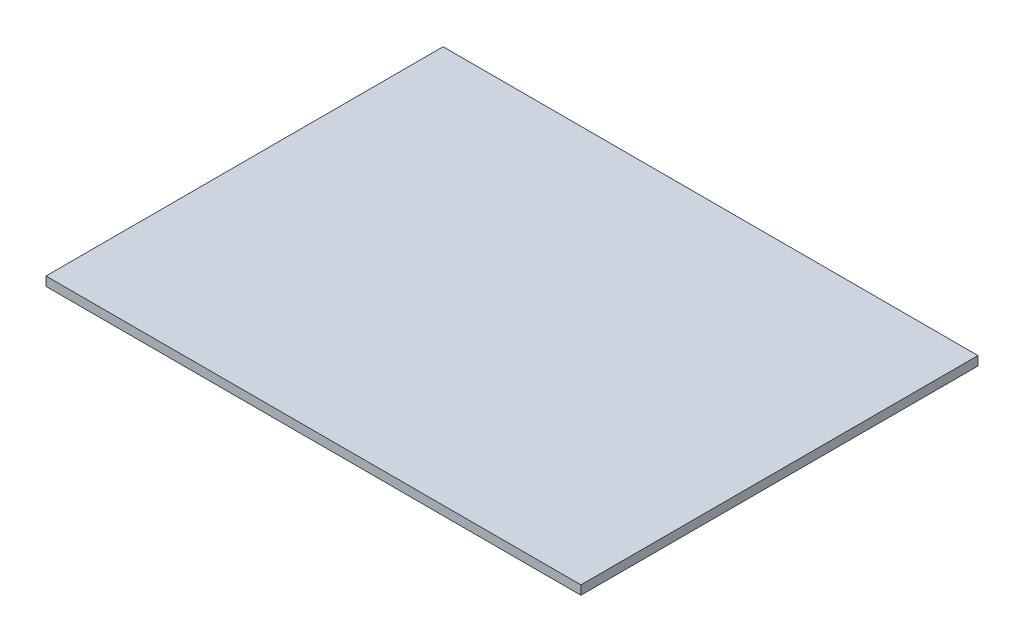
ISO-10303-21;
HEADER;
FILE_DESCRIPTION(('STEP AP214'),'2;1');
FILE_NAME('part.step','',(''),(''),'','','');
FILE_SCHEMA(('AUTOMOTIVE_DESIGN { 1 0 10303 214 1 1 1 1 }'));
ENDSEC;
DATA;
#1=APPLICATION_CONTEXT('core data for automotive mechanical design processes');
#2=APPLICATION_PROTOCOL_DEFINITION('international standard','automotive_design',2000,#1);
#3=PRODUCT_CONTEXT('',#1,'mechanical');
#4=PRODUCT('Part','Part','',(#3));
#5=PRODUCT_RELATED_PRODUCT_CATEGORY('part','',(#4));
#6=PRODUCT_DEFINITION_FORMATION('','',#4);
#7=PRODUCT_DEFINITION_CONTEXT('part definition',#1,'design');
#8=PRODUCT_DEFINITION('design','',#6,#7);
#9=PRODUCT_DEFINITION_SHAPE('','',#8);
#10=(LENGTH_UNIT() NAMED_UNIT(*) SI_UNIT(.MILLI.,.METRE.));
#11=(NAMED_UNIT(*) PLANE_ANGLE_UNIT() SI_UNIT($,.RADIAN.));
#12=(NAMED_UNIT(*) SI_UNIT($,.STERADIAN.) SOLID_ANGLE_UNIT());
#13=UNCERTAINTY_MEASURE_WITH_UNIT(LENGTH_MEASURE(1.E-05),#10,'distance_accuracy_value','');
#14=(GEOMETRIC_REPRESENTATION_CONTEXT(3) GLOBAL_UNCERTAINTY_ASSIGNED_CONTEXT((#13)) GLOBAL_UNIT_ASSIGNED_CONTEXT((#10,
#11,#12)) REPRESENTATION_CONTEXT('',''));
#15=CARTESIAN_POINT('',(0.,0.,0.));
#16=DIRECTION('',(0.,0.,1.));
#17=DIRECTION('',(1.,0.,0.));
#18=AXIS2_PLACEMENT_3D('',#15,#16,#17);
#19=CARTESIAN_POINT('',(-45.847,1.5494,34.036));
#20=DIRECTION('',(1.,0.,0.));
#21=DIRECTION('',(0.,0.,-1.));
#22=AXIS2_PLACEMENT_3D('',#19,#20,#21);
#23=PLANE('',#22);
#24=DIRECTION('',(0.,0.,1.));
#25=VECTOR('',#24,1.);
#26=CARTESIAN_POINT('',(-45.847,0.,34.036));
#27=LINE('',#26,#25);
#28=CARTESIAN_POINT('',(-45.847,0.,-34.036));
#29=VERTEX_POINT('',#28);
#30=CARTESIAN_POINT('',(-45.847,0.,34.036));
#31=VERTEX_POINT('',#30);
#32=EDGE_CURVE('E96',#29,#31,#27,.T.);
#33=ORIENTED_EDGE('',*,*,#32,.T.);
#34=DIRECTION('',(0.,-1.,0.));
#35=VECTOR('',#34,1.);
#36=CARTESIAN_POINT('',(-45.847,1.5494,34.036));
#37=LINE('',#36,#35);
#38=CARTESIAN_POINT('',(-45.847,1.5494,34.036));
#39=VERTEX_POINT('',#38);
#40=EDGE_CURVE('E11',#39,#31,#37,.T.);
#41=ORIENTED_EDGE('',*,*,#40,.F.);
#42=DIRECTION('',(0.,0.,1.));
#43=VECTOR('',#42,1.);
#44=CARTESIAN_POINT('',(-45.847,1.5494,34.036));
#45=LINE('',#44,#43);
#46=CARTESIAN_POINT('',(-45.847,1.5494,-34.036));
#47=VERTEX_POINT('',#46);
#48=EDGE_CURVE('E84',#47,#39,#45,.T.);
#49=ORIENTED_EDGE('',*,*,#48,.F.);
#50=DIRECTION('',(0.,-1.,0.));
#51=VECTOR('',#50,1.);
#52=CARTESIAN_POINT('',(-45.847,1.5494,-34.036));
#53=LINE('',#52,#51);
#54=EDGE_CURVE('E92',#47,#29,#53,.T.);
#55=ORIENTED_EDGE('',*,*,#54,.T.);
#56=EDGE_LOOP('',(#33,#41,#49,#55));
#57=FACE_BOUND('',#56,.T.);
#58=ADVANCED_FACE('F33',(#57),#23,.F.);
#59=CARTESIAN_POINT('',(45.847,1.5494,34.036));
#60=DIRECTION('',(0.,0.,-1.));
#61=DIRECTION('',(-1.,0.,0.));
#62=AXIS2_PLACEMENT_3D('',#59,#60,#61);
#63=PLANE('',#62);
#64=DIRECTION('',(1.,0.,0.));
#65=VECTOR('',#64,1.);
#66=CARTESIAN_POINT('',(45.847,0.,34.036));
#67=LINE('',#66,#65);
#68=CARTESIAN_POINT('',(45.847,0.,34.036));
#69=VERTEX_POINT('',#68);
#70=EDGE_CURVE('E88',#31,#69,#67,.T.);
#71=ORIENTED_EDGE('',*,*,#70,.T.);
#72=DIRECTION('',(0.,-1.,0.));
#73=VECTOR('',#72,1.);
#74=CARTESIAN_POINT('',(45.847,1.5494,34.036));
#75=LINE('',#74,#73);
#76=CARTESIAN_POINT('',(45.847,1.5494,34.036));
#77=VERTEX_POINT('',#76);
#78=EDGE_CURVE('E41',#77,#69,#75,.T.);
#79=ORIENTED_EDGE('',*,*,#78,.F.);
#80=DIRECTION('',(1.,0.,0.));
#81=VECTOR('',#80,1.);
#82=CARTESIAN_POINT('',(45.847,1.5494,34.036));
#83=LINE('',#82,#81);
#84=EDGE_CURVE('E79',#39,#77,#83,.T.);
#85=ORIENTED_EDGE('',*,*,#84,.F.);
#86=ORIENTED_EDGE('',*,*,#40,.T.);
#87=EDGE_LOOP('',(#71,#79,#85,#86));
#88=FACE_BOUND('',#87,.T.);
#89=ADVANCED_FACE('F87',(#88),#63,.F.);
#90=CARTESIAN_POINT('',(45.847,1.5494,34.036));
#91=DIRECTION('',(-1.,0.,0.));
#92=DIRECTION('',(0.,0.,1.));
#93=AXIS2_PLACEMENT_3D('',#90,#91,#92);
#94=PLANE('',#93);
#95=DIRECTION('',(0.,0.,-1.));
#96=VECTOR('',#95,1.);
#97=CARTESIAN_POINT('',(45.847,0.,34.036));
#98=LINE('',#97,#96);
#99=CARTESIAN_POINT('',(45.847,0.,-34.036));
#100=VERTEX_POINT('',#99);
#101=EDGE_CURVE('E66',#69,#100,#98,.T.);
#102=ORIENTED_EDGE('',*,*,#101,.T.);
#103=DIRECTION('',(0.,-1.,0.));
#104=VECTOR('',#103,1.);
#105=CARTESIAN_POINT('',(45.847,1.5494,-34.036));
#106=LINE('',#105,#104);
#107=CARTESIAN_POINT('',(45.847,1.5494,-34.036));
#108=VERTEX_POINT('',#107);
#109=EDGE_CURVE('E89',#108,#100,#106,.T.);
#110=ORIENTED_EDGE('',*,*,#109,.F.);
#111=DIRECTION('',(0.,0.,-1.));
#112=VECTOR('',#111,1.);
#113=CARTESIAN_POINT('',(45.847,1.5494,34.036));
#114=LINE('',#113,#112);
#115=EDGE_CURVE('E82',#77,#108,#114,.T.);
#116=ORIENTED_EDGE('',*,*,#115,.F.);
#117=ORIENTED_EDGE('',*,*,#78,.T.);
#118=EDGE_LOOP('',(#102,#110,#116,#117));
#119=FACE_BOUND('',#118,.T.);
#120=ADVANCED_FACE('F90',(#119),#94,.F.);
#121=CARTESIAN_POINT('',(45.847,1.5494,-34.036));
#122=DIRECTION('',(0.,0.,1.));
#123=DIRECTION('',(1.,0.,0.));
#124=AXIS2_PLACEMENT_3D('',#121,#122,#123);
#125=PLANE('',#124);
#126=DIRECTION('',(-1.,0.,0.));
#127=VECTOR('',#126,1.);
#128=CARTESIAN_POINT('',(45.847,0.,-34.036));
#129=LINE('',#128,#127);
#130=EDGE_CURVE('E72',#100,#29,#129,.T.);
#131=ORIENTED_EDGE('',*,*,#130,.T.);
#132=ORIENTED_EDGE('',*,*,#54,.F.);
#133=DIRECTION('',(-1.,0.,0.));
#134=VECTOR('',#133,1.);
#135=CARTESIAN_POINT('',(45.847,1.5494,-34.036));
#136=LINE('',#135,#134);
#137=EDGE_CURVE('E49',#108,#47,#136,.T.);
#138=ORIENTED_EDGE('',*,*,#137,.F.);
#139=ORIENTED_EDGE('',*,*,#109,.T.);
#140=EDGE_LOOP('',(#131,#132,#138,#139));
#141=FACE_BOUND('',#140,.T.);
#142=ADVANCED_FACE('F103',(#141),#125,.F.);
#143=CARTESIAN_POINT('',(0.,1.5494,0.));
#144=DIRECTION('',(0.,1.,0.));
#145=DIRECTION('',(0.,0.,1.));
#146=AXIS2_PLACEMENT_3D('',#143,#144,#145);
#147=PLANE('',#146);
#148=ORIENTED_EDGE('',*,*,#48,.T.);
#149=ORIENTED_EDGE('',*,*,#84,.T.);
#150=ORIENTED_EDGE('',*,*,#115,.T.);
#151=ORIENTED_EDGE('',*,*,#137,.T.);
#152=EDGE_LOOP('',(#148,#149,#150,#151));
#153=FACE_BOUND('',#152,.T.);
#154=ADVANCED_FACE('F80',(#153),#147,.T.);
#155=CARTESIAN_POINT('',(0.,0.,0.));
#156=DIRECTION('',(0.,1.,0.));
#157=DIRECTION('',(0.,0.,1.));
#158=AXIS2_PLACEMENT_3D('',#155,#156,#157);
#159=PLANE('',#158);
#160=ORIENTED_EDGE('',*,*,#32,.F.);
#161=ORIENTED_EDGE('',*,*,#130,.F.);
#162=ORIENTED_EDGE('',*,*,#101,.F.);
#163=ORIENTED_EDGE('',*,*,#70,.F.);
#164=EDGE_LOOP('',(#160,#161,#162,#163));
#165=FACE_BOUND('',#164,.T.);
#166=ADVANCED_FACE('F106',(#165),#159,.F.);
#167=CLOSED_SHELL('',(#58,#89,#120,#142,#154,#166));
#168=MANIFOLD_SOLID_BREP('B2',#167);
#169=ADVANCED_BREP_SHAPE_REPRESENTATION('',(#18,#168),#14);
#170=SHAPE_DEFINITION_REPRESENTATION(#9,#169);
ENDSEC;
END-ISO-10303-21;
